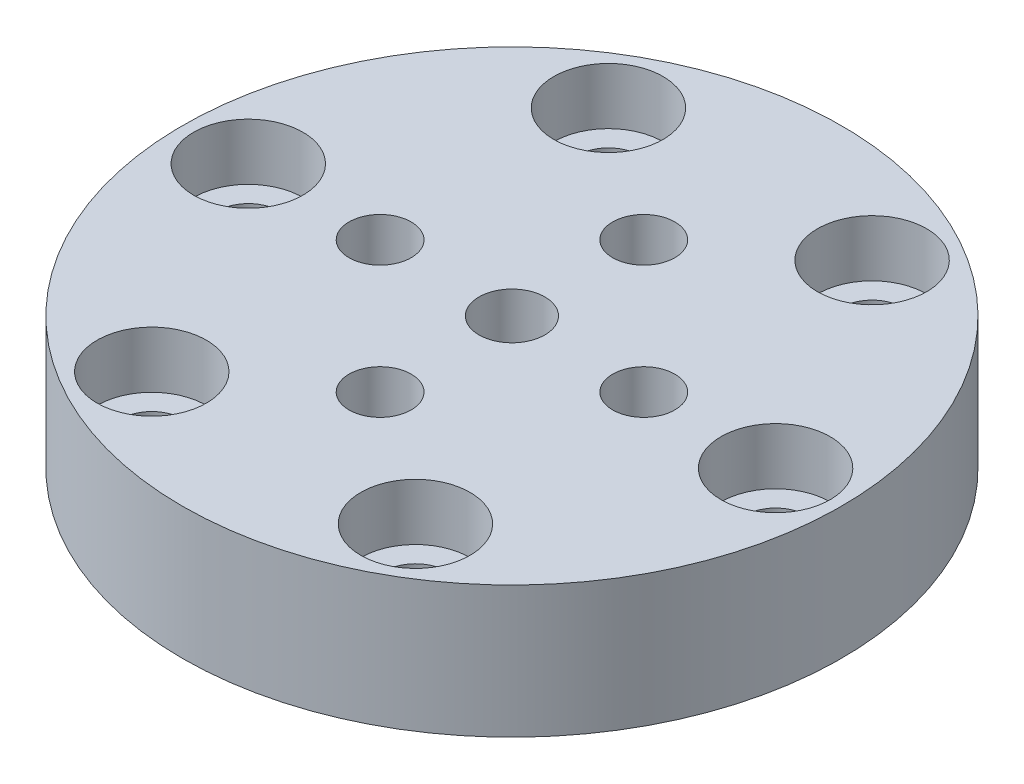
ISO-10303-21;
HEADER;
FILE_DESCRIPTION(('STEP AP214'),'2;1');
FILE_NAME('part.step','',(''),(''),'','','');
FILE_SCHEMA(('AUTOMOTIVE_DESIGN { 1 0 10303 214 1 1 1 1 }'));
ENDSEC;
DATA;
#1=APPLICATION_CONTEXT('core data for automotive mechanical design processes');
#2=APPLICATION_PROTOCOL_DEFINITION('international standard','automotive_design',2000,#1);
#3=PRODUCT_CONTEXT('',#1,'mechanical');
#4=PRODUCT('Part','Part','',(#3));
#5=PRODUCT_RELATED_PRODUCT_CATEGORY('part','',(#4));
#6=PRODUCT_DEFINITION_FORMATION('','',#4);
#7=PRODUCT_DEFINITION_CONTEXT('part definition',#1,'design');
#8=PRODUCT_DEFINITION('design','',#6,#7);
#9=PRODUCT_DEFINITION_SHAPE('','',#8);
#10=(LENGTH_UNIT() NAMED_UNIT(*) SI_UNIT(.MILLI.,.METRE.));
#11=(NAMED_UNIT(*) PLANE_ANGLE_UNIT() SI_UNIT($,.RADIAN.));
#12=(NAMED_UNIT(*) SI_UNIT($,.STERADIAN.) SOLID_ANGLE_UNIT());
#13=UNCERTAINTY_MEASURE_WITH_UNIT(LENGTH_MEASURE(1.E-05),#10,'distance_accuracy_value','');
#14=(GEOMETRIC_REPRESENTATION_CONTEXT(3) GLOBAL_UNCERTAINTY_ASSIGNED_CONTEXT((#13)) GLOBAL_UNIT_ASSIGNED_CONTEXT((#10,
#11,#12)) REPRESENTATION_CONTEXT('',''));
#15=CARTESIAN_POINT('',(0.,0.,0.));
#16=DIRECTION('',(0.,0.,1.));
#17=DIRECTION('',(1.,0.,0.));
#18=AXIS2_PLACEMENT_3D('',#15,#16,#17);
#19=CARTESIAN_POINT('',(-14.,7.,0.));
#20=DIRECTION('',(0.,-1.,0.));
#21=DIRECTION('',(0.,0.,-1.));
#22=AXIS2_PLACEMENT_3D('',#19,#20,#21);
#23=CYLINDRICAL_SURFACE('',#22,1.65);
#24=CARTESIAN_POINT('',(-14.,0.,0.));
#25=DIRECTION('',(0.,1.,0.));
#26=DIRECTION('',(0.,0.,1.));
#27=AXIS2_PLACEMENT_3D('',#24,#25,#26);
#28=CIRCLE('',#27,1.65);
#29=CARTESIAN_POINT('',(-14.,0.,1.65));
#30=VERTEX_POINT('',#29);
#31=EDGE_CURVE('E98',#30,#30,#28,.T.);
#32=ORIENTED_EDGE('',*,*,#31,.F.);
#33=EDGE_LOOP('',(#32));
#34=FACE_BOUND('',#33,.T.);
#35=CARTESIAN_POINT('',(-14.,4.,0.));
#36=DIRECTION('',(0.,1.,0.));
#37=DIRECTION('',(0.,0.,1.));
#38=AXIS2_PLACEMENT_3D('',#35,#36,#37);
#39=CIRCLE('',#38,1.65);
#40=CARTESIAN_POINT('',(-14.,4.,1.65));
#41=VERTEX_POINT('',#40);
#42=EDGE_CURVE('E47',#41,#41,#39,.T.);
#43=ORIENTED_EDGE('',*,*,#42,.T.);
#44=EDGE_LOOP('',(#43));
#45=FACE_BOUND('',#44,.T.);
#46=ADVANCED_FACE('F43',(#34,#45),#23,.F.);
#47=CARTESIAN_POINT('',(-6.99999999999997,7.,-12.1243556529822));
#48=DIRECTION('',(0.,-1.,0.));
#49=DIRECTION('',(0.,0.,-1.));
#50=AXIS2_PLACEMENT_3D('',#47,#48,#49);
#51=CYLINDRICAL_SURFACE('',#50,1.65);
#52=CARTESIAN_POINT('',(-6.99999999999997,0.,-12.1243556529822));
#53=DIRECTION('',(0.,1.,0.));
#54=DIRECTION('',(0.,0.,1.));
#55=AXIS2_PLACEMENT_3D('',#52,#53,#54);
#56=CIRCLE('',#55,1.65);
#57=CARTESIAN_POINT('',(-6.99999999999997,0.,-10.4743556529822));
#58=VERTEX_POINT('',#57);
#59=EDGE_CURVE('E94',#58,#58,#56,.T.);
#60=ORIENTED_EDGE('',*,*,#59,.F.);
#61=EDGE_LOOP('',(#60));
#62=FACE_BOUND('',#61,.T.);
#63=CARTESIAN_POINT('',(-6.99999999999997,4.,-12.1243556529822));
#64=DIRECTION('',(0.,1.,0.));
#65=DIRECTION('',(0.,0.,1.));
#66=AXIS2_PLACEMENT_3D('',#63,#64,#65);
#67=CIRCLE('',#66,1.65);
#68=CARTESIAN_POINT('',(-6.99999999999997,4.,-10.4743556529822));
#69=VERTEX_POINT('',#68);
#70=EDGE_CURVE('E127',#69,#69,#67,.T.);
#71=ORIENTED_EDGE('',*,*,#70,.T.);
#72=EDGE_LOOP('',(#71));
#73=FACE_BOUND('',#72,.T.);
#74=ADVANCED_FACE('F241',(#62,#73),#51,.F.);
#75=CARTESIAN_POINT('',(7.00000000000006,7.,-12.1243556529821));
#76=DIRECTION('',(0.,-1.,0.));
#77=DIRECTION('',(0.,0.,-1.));
#78=AXIS2_PLACEMENT_3D('',#75,#76,#77);
#79=CYLINDRICAL_SURFACE('',#78,1.65);
#80=CARTESIAN_POINT('',(7.00000000000006,0.,-12.1243556529821));
#81=DIRECTION('',(0.,1.,0.));
#82=DIRECTION('',(0.,0.,1.));
#83=AXIS2_PLACEMENT_3D('',#80,#81,#82);
#84=CIRCLE('',#83,1.65);
#85=CARTESIAN_POINT('',(7.00000000000006,0.,-10.4743556529821));
#86=VERTEX_POINT('',#85);
#87=EDGE_CURVE('E90',#86,#86,#84,.T.);
#88=ORIENTED_EDGE('',*,*,#87,.F.);
#89=EDGE_LOOP('',(#88));
#90=FACE_BOUND('',#89,.T.);
#91=CARTESIAN_POINT('',(7.00000000000006,4.,-12.1243556529821));
#92=DIRECTION('',(0.,1.,0.));
#93=DIRECTION('',(0.,0.,1.));
#94=AXIS2_PLACEMENT_3D('',#91,#92,#93);
#95=CIRCLE('',#94,1.65);
#96=CARTESIAN_POINT('',(7.00000000000006,4.,-10.4743556529821));
#97=VERTEX_POINT('',#96);
#98=EDGE_CURVE('E124',#97,#97,#95,.T.);
#99=ORIENTED_EDGE('',*,*,#98,.T.);
#100=EDGE_LOOP('',(#99));
#101=FACE_BOUND('',#100,.T.);
#102=ADVANCED_FACE('F247',(#90,#101),#79,.F.);
#103=CARTESIAN_POINT('',(14.,7.,0.));
#104=DIRECTION('',(0.,-1.,0.));
#105=DIRECTION('',(0.,0.,-1.));
#106=AXIS2_PLACEMENT_3D('',#103,#104,#105);
#107=CYLINDRICAL_SURFACE('',#106,1.65);
#108=CARTESIAN_POINT('',(14.,0.,0.));
#109=DIRECTION('',(0.,1.,0.));
#110=DIRECTION('',(0.,0.,1.));
#111=AXIS2_PLACEMENT_3D('',#108,#109,#110);
#112=CIRCLE('',#111,1.65);
#113=CARTESIAN_POINT('',(14.,0.,1.6500000000001));
#114=VERTEX_POINT('',#113);
#115=EDGE_CURVE('E86',#114,#114,#112,.T.);
#116=ORIENTED_EDGE('',*,*,#115,.F.);
#117=EDGE_LOOP('',(#116));
#118=FACE_BOUND('',#117,.T.);
#119=CARTESIAN_POINT('',(14.,4.,0.));
#120=DIRECTION('',(0.,1.,0.));
#121=DIRECTION('',(0.,0.,1.));
#122=AXIS2_PLACEMENT_3D('',#119,#120,#121);
#123=CIRCLE('',#122,1.65);
#124=CARTESIAN_POINT('',(14.,4.,1.6500000000001));
#125=VERTEX_POINT('',#124);
#126=EDGE_CURVE('E120',#125,#125,#123,.T.);
#127=ORIENTED_EDGE('',*,*,#126,.T.);
#128=EDGE_LOOP('',(#127));
#129=FACE_BOUND('',#128,.T.);
#130=ADVANCED_FACE('F254',(#118,#129),#107,.F.);
#131=CARTESIAN_POINT('',(6.99999999999989,7.,12.1243556529822));
#132=DIRECTION('',(0.,-1.,0.));
#133=DIRECTION('',(0.,0.,-1.));
#134=AXIS2_PLACEMENT_3D('',#131,#132,#133);
#135=CYLINDRICAL_SURFACE('',#134,1.65);
#136=CARTESIAN_POINT('',(6.99999999999989,0.,12.1243556529822));
#137=DIRECTION('',(0.,1.,0.));
#138=DIRECTION('',(0.,0.,1.));
#139=AXIS2_PLACEMENT_3D('',#136,#137,#138);
#140=CIRCLE('',#139,1.65);
#141=CARTESIAN_POINT('',(6.99999999999989,0.,13.7743556529822));
#142=VERTEX_POINT('',#141);
#143=EDGE_CURVE('E82',#142,#142,#140,.T.);
#144=ORIENTED_EDGE('',*,*,#143,.F.);
#145=EDGE_LOOP('',(#144));
#146=FACE_BOUND('',#145,.T.);
#147=CARTESIAN_POINT('',(6.99999999999989,4.,12.1243556529822));
#148=DIRECTION('',(0.,1.,0.));
#149=DIRECTION('',(0.,0.,1.));
#150=AXIS2_PLACEMENT_3D('',#147,#148,#149);
#151=CIRCLE('',#150,1.65);
#152=CARTESIAN_POINT('',(6.99999999999989,4.,13.7743556529822));
#153=VERTEX_POINT('',#152);
#154=EDGE_CURVE('E115',#153,#153,#151,.T.);
#155=ORIENTED_EDGE('',*,*,#154,.T.);
#156=EDGE_LOOP('',(#155));
#157=FACE_BOUND('',#156,.T.);
#158=ADVANCED_FACE('F258',(#146,#157),#135,.F.);
#159=CARTESIAN_POINT('',(-7.00000000000014,7.,12.1243556529821));
#160=DIRECTION('',(0.,-1.,0.));
#161=DIRECTION('',(0.,0.,-1.));
#162=AXIS2_PLACEMENT_3D('',#159,#160,#161);
#163=CYLINDRICAL_SURFACE('',#162,1.65);
#164=CARTESIAN_POINT('',(-7.00000000000014,0.,12.1243556529821));
#165=DIRECTION('',(0.,1.,0.));
#166=DIRECTION('',(0.,0.,1.));
#167=AXIS2_PLACEMENT_3D('',#164,#165,#166);
#168=CIRCLE('',#167,1.65);
#169=CARTESIAN_POINT('',(-7.00000000000014,0.,13.7743556529821));
#170=VERTEX_POINT('',#169);
#171=EDGE_CURVE('E78',#170,#170,#168,.T.);
#172=ORIENTED_EDGE('',*,*,#171,.F.);
#173=EDGE_LOOP('',(#172));
#174=FACE_BOUND('',#173,.T.);
#175=CARTESIAN_POINT('',(-7.00000000000014,4.,12.1243556529821));
#176=DIRECTION('',(0.,1.,0.));
#177=DIRECTION('',(0.,0.,1.));
#178=AXIS2_PLACEMENT_3D('',#175,#176,#177);
#179=CIRCLE('',#178,1.65);
#180=CARTESIAN_POINT('',(-7.00000000000014,4.,13.7743556529821));
#181=VERTEX_POINT('',#180);
#182=EDGE_CURVE('E111',#181,#181,#179,.T.);
#183=ORIENTED_EDGE('',*,*,#182,.T.);
#184=EDGE_LOOP('',(#183));
#185=FACE_BOUND('',#184,.T.);
#186=ADVANCED_FACE('F222',(#174,#185),#163,.F.);
#187=CARTESIAN_POINT('',(0.,7.,0.));
#188=DIRECTION('',(0.,-1.,0.));
#189=DIRECTION('',(0.,0.,-1.));
#190=AXIS2_PLACEMENT_3D('',#187,#188,#189);
#191=CYLINDRICAL_SURFACE('',#190,17.5);
#192=CARTESIAN_POINT('',(0.,7.,0.));
#193=DIRECTION('',(0.,1.,0.));
#194=DIRECTION('',(0.,0.,1.));
#195=AXIS2_PLACEMENT_3D('',#192,#193,#194);
#196=CIRCLE('',#195,17.5);
#197=CARTESIAN_POINT('',(0.,7.,17.5));
#198=VERTEX_POINT('',#197);
#199=EDGE_CURVE('E52',#198,#198,#196,.T.);
#200=ORIENTED_EDGE('',*,*,#199,.F.);
#201=EDGE_LOOP('',(#200));
#202=FACE_BOUND('',#201,.T.);
#203=CARTESIAN_POINT('',(0.,0.,0.));
#204=DIRECTION('',(0.,1.,0.));
#205=DIRECTION('',(0.,0.,1.));
#206=AXIS2_PLACEMENT_3D('',#203,#204,#205);
#207=CIRCLE('',#206,17.5);
#208=CARTESIAN_POINT('',(0.,0.,17.5));
#209=VERTEX_POINT('',#208);
#210=EDGE_CURVE('E102',#209,#209,#207,.T.);
#211=ORIENTED_EDGE('',*,*,#210,.T.);
#212=EDGE_LOOP('',(#211));
#213=FACE_BOUND('',#212,.T.);
#214=ADVANCED_FACE('F219',(#202,#213),#191,.T.);
#215=CARTESIAN_POINT('',(-7.,7.,0.));
#216=DIRECTION('',(0.,-1.,0.));
#217=DIRECTION('',(0.,0.,-1.));
#218=AXIS2_PLACEMENT_3D('',#215,#216,#217);
#219=CYLINDRICAL_SURFACE('',#218,1.65);
#220=CARTESIAN_POINT('',(-7.,7.,0.));
#221=DIRECTION('',(0.,1.,0.));
#222=DIRECTION('',(0.,0.,1.));
#223=AXIS2_PLACEMENT_3D('',#220,#221,#222);
#224=CIRCLE('',#223,1.65);
#225=CARTESIAN_POINT('',(-7.,7.,1.64999999999995));
#226=VERTEX_POINT('',#225);
#227=EDGE_CURVE('E58',#226,#226,#224,.T.);
#228=ORIENTED_EDGE('',*,*,#227,.T.);
#229=EDGE_LOOP('',(#228));
#230=FACE_BOUND('',#229,.T.);
#231=CARTESIAN_POINT('',(-7.,0.,0.));
#232=DIRECTION('',(0.,1.,0.));
#233=DIRECTION('',(0.,0.,1.));
#234=AXIS2_PLACEMENT_3D('',#231,#232,#233);
#235=CIRCLE('',#234,1.65);
#236=CARTESIAN_POINT('',(-7.,0.,1.64999999999995));
#237=VERTEX_POINT('',#236);
#238=EDGE_CURVE('E74',#237,#237,#235,.T.);
#239=ORIENTED_EDGE('',*,*,#238,.F.);
#240=EDGE_LOOP('',(#239));
#241=FACE_BOUND('',#240,.T.);
#242=ADVANCED_FACE('F206',(#230,#241),#219,.F.);
#243=CARTESIAN_POINT('',(0.,7.,7.));
#244=DIRECTION('',(0.,-1.,0.));
#245=DIRECTION('',(0.,0.,-1.));
#246=AXIS2_PLACEMENT_3D('',#243,#244,#245);
#247=CYLINDRICAL_SURFACE('',#246,1.65);
#248=CARTESIAN_POINT('',(0.,7.,7.));
#249=DIRECTION('',(0.,1.,0.));
#250=DIRECTION('',(0.,0.,1.));
#251=AXIS2_PLACEMENT_3D('',#248,#249,#250);
#252=CIRCLE('',#251,1.65);
#253=CARTESIAN_POINT('',(0.,7.,8.65));
#254=VERTEX_POINT('',#253);
#255=EDGE_CURVE('E199',#254,#254,#252,.T.);
#256=ORIENTED_EDGE('',*,*,#255,.T.);
#257=EDGE_LOOP('',(#256));
#258=FACE_BOUND('',#257,.T.);
#259=CARTESIAN_POINT('',(0.,0.,7.));
#260=DIRECTION('',(0.,1.,0.));
#261=DIRECTION('',(0.,0.,1.));
#262=AXIS2_PLACEMENT_3D('',#259,#260,#261);
#263=CIRCLE('',#262,1.65);
#264=CARTESIAN_POINT('',(0.,0.,8.65));
#265=VERTEX_POINT('',#264);
#266=EDGE_CURVE('E70',#265,#265,#263,.T.);
#267=ORIENTED_EDGE('',*,*,#266,.F.);
#268=EDGE_LOOP('',(#267));
#269=FACE_BOUND('',#268,.T.);
#270=ADVANCED_FACE('F268',(#258,#269),#247,.F.);
#271=CARTESIAN_POINT('',(7.,7.,0.));
#272=DIRECTION('',(0.,-1.,0.));
#273=DIRECTION('',(0.,0.,-1.));
#274=AXIS2_PLACEMENT_3D('',#271,#272,#273);
#275=CYLINDRICAL_SURFACE('',#274,1.65);
#276=CARTESIAN_POINT('',(7.,7.,0.));
#277=DIRECTION('',(0.,1.,0.));
#278=DIRECTION('',(0.,0.,1.));
#279=AXIS2_PLACEMENT_3D('',#276,#277,#278);
#280=CIRCLE('',#279,1.65);
#281=CARTESIAN_POINT('',(7.,7.,1.65));
#282=VERTEX_POINT('',#281);
#283=EDGE_CURVE('E195',#282,#282,#280,.T.);
#284=ORIENTED_EDGE('',*,*,#283,.T.);
#285=EDGE_LOOP('',(#284));
#286=FACE_BOUND('',#285,.T.);
#287=CARTESIAN_POINT('',(7.,0.,0.));
#288=DIRECTION('',(0.,1.,0.));
#289=DIRECTION('',(0.,0.,1.));
#290=AXIS2_PLACEMENT_3D('',#287,#288,#289);
#291=CIRCLE('',#290,1.65);
#292=CARTESIAN_POINT('',(7.,0.,1.65));
#293=VERTEX_POINT('',#292);
#294=EDGE_CURVE('E66',#293,#293,#291,.T.);
#295=ORIENTED_EDGE('',*,*,#294,.F.);
#296=EDGE_LOOP('',(#295));
#297=FACE_BOUND('',#296,.T.);
#298=ADVANCED_FACE('F238',(#286,#297),#275,.F.);
#299=CARTESIAN_POINT('',(0.,7.,-7.));
#300=DIRECTION('',(0.,-1.,0.));
#301=DIRECTION('',(0.,0.,-1.));
#302=AXIS2_PLACEMENT_3D('',#299,#300,#301);
#303=CYLINDRICAL_SURFACE('',#302,1.65);
#304=CARTESIAN_POINT('',(0.,7.,-7.));
#305=DIRECTION('',(0.,1.,0.));
#306=DIRECTION('',(0.,0.,1.));
#307=AXIS2_PLACEMENT_3D('',#304,#305,#306);
#308=CIRCLE('',#307,1.65);
#309=CARTESIAN_POINT('',(0.,7.,-5.35));
#310=VERTEX_POINT('',#309);
#311=EDGE_CURVE('E110',#310,#310,#308,.T.);
#312=ORIENTED_EDGE('',*,*,#311,.T.);
#313=EDGE_LOOP('',(#312));
#314=FACE_BOUND('',#313,.T.);
#315=CARTESIAN_POINT('',(0.,0.,-7.));
#316=DIRECTION('',(0.,1.,0.));
#317=DIRECTION('',(0.,0.,1.));
#318=AXIS2_PLACEMENT_3D('',#315,#316,#317);
#319=CIRCLE('',#318,1.65);
#320=CARTESIAN_POINT('',(0.,0.,-5.35));
#321=VERTEX_POINT('',#320);
#322=EDGE_CURVE('E62',#321,#321,#319,.T.);
#323=ORIENTED_EDGE('',*,*,#322,.F.);
#324=EDGE_LOOP('',(#323));
#325=FACE_BOUND('',#324,.T.);
#326=ADVANCED_FACE('F45',(#314,#325),#303,.F.);
#327=CARTESIAN_POINT('',(0.,7.,0.));
#328=DIRECTION('',(0.,-1.,0.));
#329=DIRECTION('',(0.,0.,-1.));
#330=AXIS2_PLACEMENT_3D('',#327,#328,#329);
#331=CYLINDRICAL_SURFACE('',#330,1.75);
#332=CARTESIAN_POINT('',(0.,7.,0.));
#333=DIRECTION('',(0.,1.,0.));
#334=DIRECTION('',(0.,0.,1.));
#335=AXIS2_PLACEMENT_3D('',#332,#333,#334);
#336=CIRCLE('',#335,1.75);
#337=CARTESIAN_POINT('',(0.,7.,1.75));
#338=VERTEX_POINT('',#337);
#339=EDGE_CURVE('E10',#338,#338,#336,.T.);
#340=ORIENTED_EDGE('',*,*,#339,.T.);
#341=EDGE_LOOP('',(#340));
#342=FACE_BOUND('',#341,.T.);
#343=CARTESIAN_POINT('',(0.,0.,0.));
#344=DIRECTION('',(0.,1.,0.));
#345=DIRECTION('',(0.,0.,1.));
#346=AXIS2_PLACEMENT_3D('',#343,#344,#345);
#347=CIRCLE('',#346,1.75);
#348=CARTESIAN_POINT('',(0.,0.,1.75));
#349=VERTEX_POINT('',#348);
#350=EDGE_CURVE('E106',#349,#349,#347,.T.);
#351=ORIENTED_EDGE('',*,*,#350,.F.);
#352=EDGE_LOOP('',(#351));
#353=FACE_BOUND('',#352,.T.);
#354=ADVANCED_FACE('F213',(#342,#353),#331,.F.);
#355=CARTESIAN_POINT('',(0.,7.,0.));
#356=DIRECTION('',(0.,1.,0.));
#357=DIRECTION('',(0.,0.,1.));
#358=AXIS2_PLACEMENT_3D('',#355,#356,#357);
#359=PLANE('',#358);
#360=CARTESIAN_POINT('',(-14.,7.,0.));
#361=DIRECTION('',(0.,1.,0.));
#362=DIRECTION('',(0.,0.,1.));
#363=AXIS2_PLACEMENT_3D('',#360,#361,#362);
#364=CIRCLE('',#363,2.9);
#365=CARTESIAN_POINT('',(-14.,7.,2.9));
#366=VERTEX_POINT('',#365);
#367=EDGE_CURVE('E146',#366,#366,#364,.T.);
#368=ORIENTED_EDGE('',*,*,#367,.F.);
#369=EDGE_LOOP('',(#368));
#370=FACE_BOUND('',#369,.T.);
#371=CARTESIAN_POINT('',(-7.00000000000014,7.,12.1243556529821));
#372=DIRECTION('',(0.,1.,0.));
#373=DIRECTION('',(0.,0.,1.));
#374=AXIS2_PLACEMENT_3D('',#371,#372,#373);
#375=CIRCLE('',#374,2.9);
#376=CARTESIAN_POINT('',(-7.00000000000014,7.,15.0243556529821));
#377=VERTEX_POINT('',#376);
#378=EDGE_CURVE('E153',#377,#377,#375,.T.);
#379=ORIENTED_EDGE('',*,*,#378,.F.);
#380=EDGE_LOOP('',(#379));
#381=FACE_BOUND('',#380,.T.);
#382=CARTESIAN_POINT('',(6.99999999999989,7.,12.1243556529822));
#383=DIRECTION('',(0.,1.,0.));
#384=DIRECTION('',(0.,0.,1.));
#385=AXIS2_PLACEMENT_3D('',#382,#383,#384);
#386=CIRCLE('',#385,2.9);
#387=CARTESIAN_POINT('',(6.99999999999989,7.,15.0243556529822));
#388=VERTEX_POINT('',#387);
#389=EDGE_CURVE('E185',#388,#388,#386,.T.);
#390=ORIENTED_EDGE('',*,*,#389,.F.);
#391=EDGE_LOOP('',(#390));
#392=FACE_BOUND('',#391,.T.);
#393=CARTESIAN_POINT('',(14.,7.,0.));
#394=DIRECTION('',(0.,1.,0.));
#395=DIRECTION('',(0.,0.,1.));
#396=AXIS2_PLACEMENT_3D('',#393,#394,#395);
#397=CIRCLE('',#396,2.9);
#398=CARTESIAN_POINT('',(14.,7.,2.9000000000001));
#399=VERTEX_POINT('',#398);
#400=EDGE_CURVE('E177',#399,#399,#397,.T.);
#401=ORIENTED_EDGE('',*,*,#400,.F.);
#402=EDGE_LOOP('',(#401));
#403=FACE_BOUND('',#402,.T.);
#404=CARTESIAN_POINT('',(7.00000000000006,7.,-12.1243556529821));
#405=DIRECTION('',(0.,1.,0.));
#406=DIRECTION('',(0.,0.,1.));
#407=AXIS2_PLACEMENT_3D('',#404,#405,#406);
#408=CIRCLE('',#407,2.9);
#409=CARTESIAN_POINT('',(7.00000000000006,7.,-9.22435565298211));
#410=VERTEX_POINT('',#409);
#411=EDGE_CURVE('E169',#410,#410,#408,.T.);
#412=ORIENTED_EDGE('',*,*,#411,.F.);
#413=EDGE_LOOP('',(#412));
#414=FACE_BOUND('',#413,.T.);
#415=CARTESIAN_POINT('',(-6.99999999999997,7.,-12.1243556529822));
#416=DIRECTION('',(0.,1.,0.));
#417=DIRECTION('',(0.,0.,1.));
#418=AXIS2_PLACEMENT_3D('',#415,#416,#417);
#419=CIRCLE('',#418,2.9);
#420=CARTESIAN_POINT('',(-6.99999999999997,7.,-9.22435565298216));
#421=VERTEX_POINT('',#420);
#422=EDGE_CURVE('E150',#421,#421,#419,.T.);
#423=ORIENTED_EDGE('',*,*,#422,.F.);
#424=EDGE_LOOP('',(#423));
#425=FACE_BOUND('',#424,.T.);
#426=ORIENTED_EDGE('',*,*,#311,.F.);
#427=EDGE_LOOP('',(#426));
#428=FACE_BOUND('',#427,.T.);
#429=ORIENTED_EDGE('',*,*,#283,.F.);
#430=EDGE_LOOP('',(#429));
#431=FACE_BOUND('',#430,.T.);
#432=ORIENTED_EDGE('',*,*,#255,.F.);
#433=EDGE_LOOP('',(#432));
#434=FACE_BOUND('',#433,.T.);
#435=ORIENTED_EDGE('',*,*,#227,.F.);
#436=EDGE_LOOP('',(#435));
#437=FACE_BOUND('',#436,.T.);
#438=ORIENTED_EDGE('',*,*,#199,.T.);
#439=EDGE_LOOP('',(#438));
#440=FACE_BOUND('',#439,.T.);
#441=ORIENTED_EDGE('',*,*,#339,.F.);
#442=EDGE_LOOP('',(#441));
#443=FACE_BOUND('',#442,.T.);
#444=ADVANCED_FACE('F209',(#370,#381,#392,#403,#414,#425,#428,#431,#434,#437,#440,#443),#359,.T.);
#445=CARTESIAN_POINT('',(0.,0.,0.));
#446=DIRECTION('',(0.,1.,0.));
#447=DIRECTION('',(0.,0.,1.));
#448=AXIS2_PLACEMENT_3D('',#445,#446,#447);
#449=PLANE('',#448);
#450=ORIENTED_EDGE('',*,*,#322,.T.);
#451=EDGE_LOOP('',(#450));
#452=FACE_BOUND('',#451,.T.);
#453=ORIENTED_EDGE('',*,*,#294,.T.);
#454=EDGE_LOOP('',(#453));
#455=FACE_BOUND('',#454,.T.);
#456=ORIENTED_EDGE('',*,*,#266,.T.);
#457=EDGE_LOOP('',(#456));
#458=FACE_BOUND('',#457,.T.);
#459=ORIENTED_EDGE('',*,*,#238,.T.);
#460=EDGE_LOOP('',(#459));
#461=FACE_BOUND('',#460,.T.);
#462=ORIENTED_EDGE('',*,*,#171,.T.);
#463=EDGE_LOOP('',(#462));
#464=FACE_BOUND('',#463,.T.);
#465=ORIENTED_EDGE('',*,*,#143,.T.);
#466=EDGE_LOOP('',(#465));
#467=FACE_BOUND('',#466,.T.);
#468=ORIENTED_EDGE('',*,*,#115,.T.);
#469=EDGE_LOOP('',(#468));
#470=FACE_BOUND('',#469,.T.);
#471=ORIENTED_EDGE('',*,*,#87,.T.);
#472=EDGE_LOOP('',(#471));
#473=FACE_BOUND('',#472,.T.);
#474=ORIENTED_EDGE('',*,*,#59,.T.);
#475=EDGE_LOOP('',(#474));
#476=FACE_BOUND('',#475,.T.);
#477=ORIENTED_EDGE('',*,*,#31,.T.);
#478=EDGE_LOOP('',(#477));
#479=FACE_BOUND('',#478,.T.);
#480=ORIENTED_EDGE('',*,*,#210,.F.);
#481=EDGE_LOOP('',(#480));
#482=FACE_BOUND('',#481,.T.);
#483=ORIENTED_EDGE('',*,*,#350,.T.);
#484=EDGE_LOOP('',(#483));
#485=FACE_BOUND('',#484,.T.);
#486=ADVANCED_FACE('F212',(#452,#455,#458,#461,#464,#467,#470,#473,#476,#479,#482,#485),#449,.F.);
#487=CARTESIAN_POINT('',(-6.99999999999997,4.,-12.1243556529822));
#488=DIRECTION('',(0.,1.,0.));
#489=DIRECTION('',(0.,0.,1.));
#490=AXIS2_PLACEMENT_3D('',#487,#488,#489);
#491=CYLINDRICAL_SURFACE('',#490,2.9);
#492=CARTESIAN_POINT('',(-6.99999999999997,4.,-12.1243556529822));
#493=DIRECTION('',(0.,1.,0.));
#494=DIRECTION('',(0.,0.,1.));
#495=AXIS2_PLACEMENT_3D('',#492,#493,#494);
#496=CIRCLE('',#495,2.9);
#497=CARTESIAN_POINT('',(-6.99999999999997,4.,-9.22435565298216));
#498=VERTEX_POINT('',#497);
#499=EDGE_CURVE('E165',#498,#498,#496,.T.);
#500=ORIENTED_EDGE('',*,*,#499,.F.);
#501=EDGE_LOOP('',(#500));
#502=FACE_BOUND('',#501,.T.);
#503=ORIENTED_EDGE('',*,*,#422,.T.);
#504=EDGE_LOOP('',(#503));
#505=FACE_BOUND('',#504,.T.);
#506=ADVANCED_FACE('F228',(#502,#505),#491,.F.);
#507=CARTESIAN_POINT('',(-6.99999999999997,4.,-12.1243556529822));
#508=DIRECTION('',(0.,1.,0.));
#509=DIRECTION('',(0.,0.,1.));
#510=AXIS2_PLACEMENT_3D('',#507,#508,#509);
#511=PLANE('',#510);
#512=ORIENTED_EDGE('',*,*,#70,.F.);
#513=EDGE_LOOP('',(#512));
#514=FACE_BOUND('',#513,.T.);
#515=ORIENTED_EDGE('',*,*,#499,.T.);
#516=EDGE_LOOP('',(#515));
#517=FACE_BOUND('',#516,.T.);
#518=ADVANCED_FACE('F307',(#514,#517),#511,.T.);
#519=CARTESIAN_POINT('',(7.00000000000006,4.,-12.1243556529821));
#520=DIRECTION('',(0.,1.,0.));
#521=DIRECTION('',(0.,0.,1.));
#522=AXIS2_PLACEMENT_3D('',#519,#520,#521);
#523=CYLINDRICAL_SURFACE('',#522,2.9);
#524=CARTESIAN_POINT('',(7.00000000000006,4.,-12.1243556529821));
#525=DIRECTION('',(0.,1.,0.));
#526=DIRECTION('',(0.,0.,1.));
#527=AXIS2_PLACEMENT_3D('',#524,#525,#526);
#528=CIRCLE('',#527,2.9);
#529=CARTESIAN_POINT('',(7.00000000000006,4.,-9.22435565298211));
#530=VERTEX_POINT('',#529);
#531=EDGE_CURVE('E173',#530,#530,#528,.T.);
#532=ORIENTED_EDGE('',*,*,#531,.F.);
#533=EDGE_LOOP('',(#532));
#534=FACE_BOUND('',#533,.T.);
#535=ORIENTED_EDGE('',*,*,#411,.T.);
#536=EDGE_LOOP('',(#535));
#537=FACE_BOUND('',#536,.T.);
#538=ADVANCED_FACE('F301',(#534,#537),#523,.F.);
#539=CARTESIAN_POINT('',(7.00000000000006,4.,-12.1243556529821));
#540=DIRECTION('',(0.,1.,0.));
#541=DIRECTION('',(0.,0.,1.));
#542=AXIS2_PLACEMENT_3D('',#539,#540,#541);
#543=PLANE('',#542);
#544=ORIENTED_EDGE('',*,*,#98,.F.);
#545=EDGE_LOOP('',(#544));
#546=FACE_BOUND('',#545,.T.);
#547=ORIENTED_EDGE('',*,*,#531,.T.);
#548=EDGE_LOOP('',(#547));
#549=FACE_BOUND('',#548,.T.);
#550=ADVANCED_FACE('F297',(#546,#549),#543,.T.);
#551=CARTESIAN_POINT('',(14.,4.,0.));
#552=DIRECTION('',(0.,1.,0.));
#553=DIRECTION('',(0.,0.,1.));
#554=AXIS2_PLACEMENT_3D('',#551,#552,#553);
#555=CYLINDRICAL_SURFACE('',#554,2.9);
#556=CARTESIAN_POINT('',(14.,4.,0.));
#557=DIRECTION('',(0.,1.,0.));
#558=DIRECTION('',(0.,0.,1.));
#559=AXIS2_PLACEMENT_3D('',#556,#557,#558);
#560=CIRCLE('',#559,2.9);
#561=CARTESIAN_POINT('',(14.,4.,2.9000000000001));
#562=VERTEX_POINT('',#561);
#563=EDGE_CURVE('E181',#562,#562,#560,.T.);
#564=ORIENTED_EDGE('',*,*,#563,.F.);
#565=EDGE_LOOP('',(#564));
#566=FACE_BOUND('',#565,.T.);
#567=ORIENTED_EDGE('',*,*,#400,.T.);
#568=EDGE_LOOP('',(#567));
#569=FACE_BOUND('',#568,.T.);
#570=ADVANCED_FACE('F300',(#566,#569),#555,.F.);
#571=CARTESIAN_POINT('',(14.,4.,0.));
#572=DIRECTION('',(0.,1.,0.));
#573=DIRECTION('',(0.,0.,1.));
#574=AXIS2_PLACEMENT_3D('',#571,#572,#573);
#575=PLANE('',#574);
#576=ORIENTED_EDGE('',*,*,#126,.F.);
#577=EDGE_LOOP('',(#576));
#578=FACE_BOUND('',#577,.T.);
#579=ORIENTED_EDGE('',*,*,#563,.T.);
#580=EDGE_LOOP('',(#579));
#581=FACE_BOUND('',#580,.T.);
#582=ADVANCED_FACE('F337',(#578,#581),#575,.T.);
#583=CARTESIAN_POINT('',(6.99999999999989,4.,12.1243556529822));
#584=DIRECTION('',(0.,1.,0.));
#585=DIRECTION('',(0.,0.,1.));
#586=AXIS2_PLACEMENT_3D('',#583,#584,#585);
#587=CYLINDRICAL_SURFACE('',#586,2.9);
#588=CARTESIAN_POINT('',(6.99999999999989,4.,12.1243556529822));
#589=DIRECTION('',(0.,1.,0.));
#590=DIRECTION('',(0.,0.,1.));
#591=AXIS2_PLACEMENT_3D('',#588,#589,#590);
#592=CIRCLE('',#591,2.9);
#593=CARTESIAN_POINT('',(6.99999999999989,4.,15.0243556529822));
#594=VERTEX_POINT('',#593);
#595=EDGE_CURVE('E157',#594,#594,#592,.T.);
#596=ORIENTED_EDGE('',*,*,#595,.F.);
#597=EDGE_LOOP('',(#596));
#598=FACE_BOUND('',#597,.T.);
#599=ORIENTED_EDGE('',*,*,#389,.T.);
#600=EDGE_LOOP('',(#599));
#601=FACE_BOUND('',#600,.T.);
#602=ADVANCED_FACE('F341',(#598,#601),#587,.F.);
#603=CARTESIAN_POINT('',(6.99999999999989,4.,12.1243556529822));
#604=DIRECTION('',(0.,1.,0.));
#605=DIRECTION('',(0.,0.,1.));
#606=AXIS2_PLACEMENT_3D('',#603,#604,#605);
#607=PLANE('',#606);
#608=ORIENTED_EDGE('',*,*,#154,.F.);
#609=EDGE_LOOP('',(#608));
#610=FACE_BOUND('',#609,.T.);
#611=ORIENTED_EDGE('',*,*,#595,.T.);
#612=EDGE_LOOP('',(#611));
#613=FACE_BOUND('',#612,.T.);
#614=ADVANCED_FACE('F345',(#610,#613),#607,.T.);
#615=CARTESIAN_POINT('',(-7.00000000000014,4.,12.1243556529821));
#616=DIRECTION('',(0.,1.,0.));
#617=DIRECTION('',(0.,0.,1.));
#618=AXIS2_PLACEMENT_3D('',#615,#616,#617);
#619=CYLINDRICAL_SURFACE('',#618,2.9);
#620=CARTESIAN_POINT('',(-7.00000000000014,4.,12.1243556529821));
#621=DIRECTION('',(0.,1.,0.));
#622=DIRECTION('',(0.,0.,1.));
#623=AXIS2_PLACEMENT_3D('',#620,#621,#622);
#624=CIRCLE('',#623,2.9);
#625=CARTESIAN_POINT('',(-7.00000000000014,4.,15.0243556529821));
#626=VERTEX_POINT('',#625);
#627=EDGE_CURVE('E158',#626,#626,#624,.T.);
#628=ORIENTED_EDGE('',*,*,#627,.F.);
#629=EDGE_LOOP('',(#628));
#630=FACE_BOUND('',#629,.T.);
#631=ORIENTED_EDGE('',*,*,#378,.T.);
#632=EDGE_LOOP('',(#631));
#633=FACE_BOUND('',#632,.T.);
#634=ADVANCED_FACE('F348',(#630,#633),#619,.F.);
#635=CARTESIAN_POINT('',(-7.00000000000014,4.,12.1243556529821));
#636=DIRECTION('',(0.,1.,0.));
#637=DIRECTION('',(0.,0.,1.));
#638=AXIS2_PLACEMENT_3D('',#635,#636,#637);
#639=PLANE('',#638);
#640=ORIENTED_EDGE('',*,*,#182,.F.);
#641=EDGE_LOOP('',(#640));
#642=FACE_BOUND('',#641,.T.);
#643=ORIENTED_EDGE('',*,*,#627,.T.);
#644=EDGE_LOOP('',(#643));
#645=FACE_BOUND('',#644,.T.);
#646=ADVANCED_FACE('F332',(#642,#645),#639,.T.);
#647=CARTESIAN_POINT('',(-14.,4.,0.));
#648=DIRECTION('',(0.,1.,0.));
#649=DIRECTION('',(0.,0.,1.));
#650=AXIS2_PLACEMENT_3D('',#647,#648,#649);
#651=CYLINDRICAL_SURFACE('',#650,2.9);
#652=CARTESIAN_POINT('',(-14.,4.,0.));
#653=DIRECTION('',(0.,1.,0.));
#654=DIRECTION('',(0.,0.,1.));
#655=AXIS2_PLACEMENT_3D('',#652,#653,#654);
#656=CIRCLE('',#655,2.9);
#657=CARTESIAN_POINT('',(-14.,4.,2.9));
#658=VERTEX_POINT('',#657);
#659=EDGE_CURVE('E116',#658,#658,#656,.T.);
#660=ORIENTED_EDGE('',*,*,#659,.F.);
#661=EDGE_LOOP('',(#660));
#662=FACE_BOUND('',#661,.T.);
#663=ORIENTED_EDGE('',*,*,#367,.T.);
#664=EDGE_LOOP('',(#663));
#665=FACE_BOUND('',#664,.T.);
#666=ADVANCED_FACE('F140',(#662,#665),#651,.F.);
#667=CARTESIAN_POINT('',(-14.,4.,0.));
#668=DIRECTION('',(0.,1.,0.));
#669=DIRECTION('',(0.,0.,1.));
#670=AXIS2_PLACEMENT_3D('',#667,#668,#669);
#671=PLANE('',#670);
#672=ORIENTED_EDGE('',*,*,#42,.F.);
#673=EDGE_LOOP('',(#672));
#674=FACE_BOUND('',#673,.T.);
#675=ORIENTED_EDGE('',*,*,#659,.T.);
#676=EDGE_LOOP('',(#675));
#677=FACE_BOUND('',#676,.T.);
#678=ADVANCED_FACE('F137',(#674,#677),#671,.T.);
#679=CLOSED_SHELL('',(#46,#74,#102,#130,#158,#186,#214,#242,#270,#298,#326,#354,#444,#486,#506,
#518,#538,#550,#570,#582,#602,#614,#634,#646,#666,#678));
#680=MANIFOLD_SOLID_BREP('B2',#679);
#681=ADVANCED_BREP_SHAPE_REPRESENTATION('',(#18,#680),#14);
#682=SHAPE_DEFINITION_REPRESENTATION(#9,#681);
ENDSEC;
END-ISO-10303-21;
